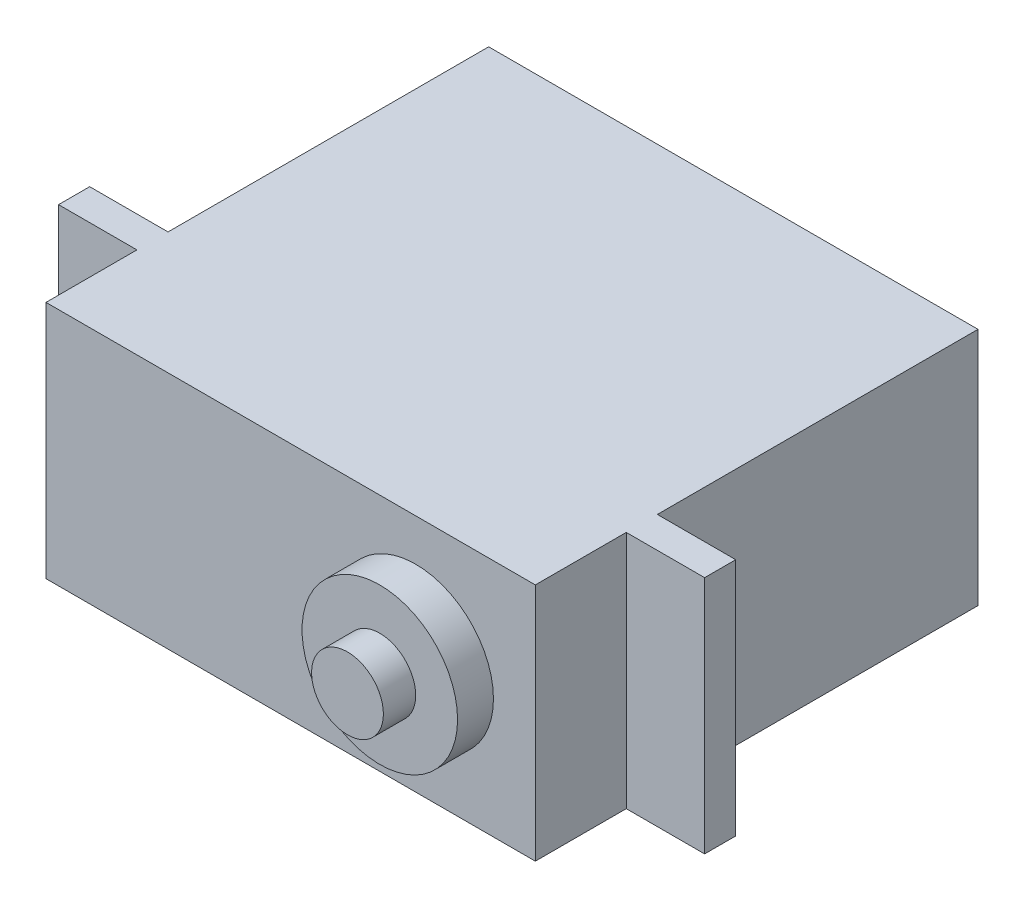
ISO-10303-21;
HEADER;
FILE_DESCRIPTION(('STEP AP214'),'2;1');
FILE_NAME('part.step','',(''),(''),'','','');
FILE_SCHEMA(('AUTOMOTIVE_DESIGN { 1 0 10303 214 1 1 1 1 }'));
ENDSEC;
DATA;
#1=APPLICATION_CONTEXT('core data for automotive mechanical design processes');
#2=APPLICATION_PROTOCOL_DEFINITION('international standard','automotive_design',2000,#1);
#3=PRODUCT_CONTEXT('',#1,'mechanical');
#4=PRODUCT('Part','Part','',(#3));
#5=PRODUCT_RELATED_PRODUCT_CATEGORY('part','',(#4));
#6=PRODUCT_DEFINITION_FORMATION('','',#4);
#7=PRODUCT_DEFINITION_CONTEXT('part definition',#1,'design');
#8=PRODUCT_DEFINITION('design','',#6,#7);
#9=PRODUCT_DEFINITION_SHAPE('','',#8);
#10=(LENGTH_UNIT() NAMED_UNIT(*) SI_UNIT(.MILLI.,.METRE.));
#11=(NAMED_UNIT(*) PLANE_ANGLE_UNIT() SI_UNIT($,.RADIAN.));
#12=(NAMED_UNIT(*) SI_UNIT($,.STERADIAN.) SOLID_ANGLE_UNIT());
#13=UNCERTAINTY_MEASURE_WITH_UNIT(LENGTH_MEASURE(1.E-05),#10,'distance_accuracy_value','');
#14=(GEOMETRIC_REPRESENTATION_CONTEXT(3) GLOBAL_UNCERTAINTY_ASSIGNED_CONTEXT((#13)) GLOBAL_UNIT_ASSIGNED_CONTEXT((#10,
#11,#12)) REPRESENTATION_CONTEXT('',''));
#15=CARTESIAN_POINT('',(0.,0.,0.));
#16=DIRECTION('',(0.,0.,1.));
#17=DIRECTION('',(1.,0.,0.));
#18=AXIS2_PLACEMENT_3D('',#15,#16,#17);
#19=CARTESIAN_POINT('',(-18.4,-10.,8.5));
#20=DIRECTION('',(1.,0.,0.));
#21=DIRECTION('',(0.,0.,-1.));
#22=AXIS2_PLACEMENT_3D('',#19,#20,#21);
#23=PLANE('',#22);
#24=DIRECTION('',(0.,1.,0.));
#25=VECTOR('',#24,1.);
#26=CARTESIAN_POINT('',(-18.4,-10.,0.9));
#27=LINE('',#26,#25);
#28=CARTESIAN_POINT('',(-18.4,-10.,0.9));
#29=VERTEX_POINT('',#28);
#30=CARTESIAN_POINT('',(-18.4,10.,0.9));
#31=VERTEX_POINT('',#30);
#32=EDGE_CURVE('E157',#29,#31,#27,.T.);
#33=ORIENTED_EDGE('',*,*,#32,.F.);
#34=DIRECTION('',(0.,0.,-1.));
#35=VECTOR('',#34,1.);
#36=CARTESIAN_POINT('',(-18.4,-10.,8.5));
#37=LINE('',#36,#35);
#38=CARTESIAN_POINT('',(-18.4,-10.,8.5));
#39=VERTEX_POINT('',#38);
#40=EDGE_CURVE('E139',#39,#29,#37,.T.);
#41=ORIENTED_EDGE('',*,*,#40,.F.);
#42=DIRECTION('',(0.,-1.,0.));
#43=VECTOR('',#42,1.);
#44=CARTESIAN_POINT('',(-18.4,-10.,8.5));
#45=LINE('',#44,#43);
#46=CARTESIAN_POINT('',(-18.4,10.,8.5));
#47=VERTEX_POINT('',#46);
#48=EDGE_CURVE('E169',#47,#39,#45,.T.);
#49=ORIENTED_EDGE('',*,*,#48,.F.);
#50=DIRECTION('',(0.,0.,-1.));
#51=VECTOR('',#50,1.);
#52=CARTESIAN_POINT('',(-18.4,10.,8.5));
#53=LINE('',#52,#51);
#54=EDGE_CURVE('E188',#47,#31,#53,.T.);
#55=ORIENTED_EDGE('',*,*,#54,.T.);
#56=EDGE_LOOP('',(#33,#41,#49,#55));
#57=FACE_BOUND('',#56,.T.);
#58=ADVANCED_FACE('F39',(#57),#23,.F.);
#59=CARTESIAN_POINT('',(22.5,-10.,8.5));
#60=DIRECTION('',(-1.,0.,0.));
#61=DIRECTION('',(0.,0.,1.));
#62=AXIS2_PLACEMENT_3D('',#59,#60,#61);
#63=PLANE('',#62);
#64=DIRECTION('',(0.,-1.,0.));
#65=VECTOR('',#64,1.);
#66=CARTESIAN_POINT('',(22.5,-10.,0.9));
#67=LINE('',#66,#65);
#68=CARTESIAN_POINT('',(22.5,10.,0.9));
#69=VERTEX_POINT('',#68);
#70=CARTESIAN_POINT('',(22.5,-10.,0.9));
#71=VERTEX_POINT('',#70);
#72=EDGE_CURVE('E48',#69,#71,#67,.T.);
#73=ORIENTED_EDGE('',*,*,#72,.F.);
#74=DIRECTION('',(0.,0.,-1.));
#75=VECTOR('',#74,1.);
#76=CARTESIAN_POINT('',(22.5,10.,8.5));
#77=LINE('',#76,#75);
#78=CARTESIAN_POINT('',(22.5,10.,8.5));
#79=VERTEX_POINT('',#78);
#80=EDGE_CURVE('E194',#79,#69,#77,.T.);
#81=ORIENTED_EDGE('',*,*,#80,.F.);
#82=DIRECTION('',(0.,1.,0.));
#83=VECTOR('',#82,1.);
#84=CARTESIAN_POINT('',(22.5,-10.,8.5));
#85=LINE('',#84,#83);
#86=CARTESIAN_POINT('',(22.5,-10.,8.5));
#87=VERTEX_POINT('',#86);
#88=EDGE_CURVE('E173',#87,#79,#85,.T.);
#89=ORIENTED_EDGE('',*,*,#88,.F.);
#90=DIRECTION('',(0.,0.,-1.));
#91=VECTOR('',#90,1.);
#92=CARTESIAN_POINT('',(22.5,-10.,8.5));
#93=LINE('',#92,#91);
#94=EDGE_CURVE('E197',#87,#71,#93,.T.);
#95=ORIENTED_EDGE('',*,*,#94,.T.);
#96=EDGE_LOOP('',(#73,#81,#89,#95));
#97=FACE_BOUND('',#96,.T.);
#98=ADVANCED_FACE('F214',(#97),#63,.F.);
#99=CARTESIAN_POINT('',(-18.4,-10.,-1.7));
#100=VERTEX_POINT('',#99);
#101=CARTESIAN_POINT('',(-18.4,-10.,-28.5));
#102=VERTEX_POINT('',#101);
#103=EDGE_CURVE('E199',#100,#102,#37,.T.);
#104=ORIENTED_EDGE('',*,*,#103,.F.);
#105=DIRECTION('',(0.,1.,0.));
#106=VECTOR('',#105,1.);
#107=CARTESIAN_POINT('',(-18.4,-10.,-1.7));
#108=LINE('',#107,#106);
#109=CARTESIAN_POINT('',(-18.4,10.,-1.7));
#110=VERTEX_POINT('',#109);
#111=EDGE_CURVE('E156',#100,#110,#108,.T.);
#112=ORIENTED_EDGE('',*,*,#111,.T.);
#113=CARTESIAN_POINT('',(-18.4,10.,-28.5));
#114=VERTEX_POINT('',#113);
#115=EDGE_CURVE('E179',#110,#114,#53,.T.);
#116=ORIENTED_EDGE('',*,*,#115,.T.);
#117=DIRECTION('',(0.,-1.,0.));
#118=VECTOR('',#117,1.);
#119=CARTESIAN_POINT('',(-18.4,-10.,-28.5));
#120=LINE('',#119,#118);
#121=EDGE_CURVE('E170',#114,#102,#120,.T.);
#122=ORIENTED_EDGE('',*,*,#121,.T.);
#123=EDGE_LOOP('',(#104,#112,#116,#122));
#124=FACE_BOUND('',#123,.T.);
#125=ADVANCED_FACE('F41',(#124),#23,.F.);
#126=CARTESIAN_POINT('',(-18.4,-10.,8.5));
#127=DIRECTION('',(0.,1.,0.));
#128=DIRECTION('',(0.,0.,1.));
#129=AXIS2_PLACEMENT_3D('',#126,#127,#128);
#130=PLANE('',#129);
#131=ORIENTED_EDGE('',*,*,#40,.T.);
#132=DIRECTION('',(1.,0.,0.));
#133=VECTOR('',#132,1.);
#134=CARTESIAN_POINT('',(-24.95,-10.,0.9));
#135=LINE('',#134,#133);
#136=CARTESIAN_POINT('',(-24.95,-10.,0.9));
#137=VERTEX_POINT('',#136);
#138=EDGE_CURVE('E128',#137,#29,#135,.T.);
#139=ORIENTED_EDGE('',*,*,#138,.F.);
#140=DIRECTION('',(0.,0.,-1.));
#141=VECTOR('',#140,1.);
#142=CARTESIAN_POINT('',(-24.95,-10.,0.9));
#143=LINE('',#142,#141);
#144=CARTESIAN_POINT('',(-24.95,-10.,-1.7));
#145=VERTEX_POINT('',#144);
#146=EDGE_CURVE('E132',#137,#145,#143,.T.);
#147=ORIENTED_EDGE('',*,*,#146,.T.);
#148=DIRECTION('',(1.,0.,0.));
#149=VECTOR('',#148,1.);
#150=CARTESIAN_POINT('',(-24.95,-10.,-1.7));
#151=LINE('',#150,#149);
#152=EDGE_CURVE('E227',#145,#100,#151,.T.);
#153=ORIENTED_EDGE('',*,*,#152,.T.);
#154=ORIENTED_EDGE('',*,*,#103,.T.);
#155=DIRECTION('',(1.,0.,0.));
#156=VECTOR('',#155,1.);
#157=CARTESIAN_POINT('',(-18.4,-10.,-28.5));
#158=LINE('',#157,#156);
#159=CARTESIAN_POINT('',(22.5,-10.,-28.5));
#160=VERTEX_POINT('',#159);
#161=EDGE_CURVE('E182',#102,#160,#158,.T.);
#162=ORIENTED_EDGE('',*,*,#161,.T.);
#163=CARTESIAN_POINT('',(22.5,-10.,-1.7));
#164=VERTEX_POINT('',#163);
#165=EDGE_CURVE('E198',#164,#160,#93,.T.);
#166=ORIENTED_EDGE('',*,*,#165,.F.);
#167=CARTESIAN_POINT('',(29.05,-10.,-1.7));
#168=VERTEX_POINT('',#167);
#169=EDGE_CURVE('E63',#164,#168,#151,.T.);
#170=ORIENTED_EDGE('',*,*,#169,.T.);
#171=DIRECTION('',(0.,0.,-1.));
#172=VECTOR('',#171,1.);
#173=CARTESIAN_POINT('',(29.05,-10.,0.9));
#174=LINE('',#173,#172);
#175=CARTESIAN_POINT('',(29.05,-10.,0.9));
#176=VERTEX_POINT('',#175);
#177=EDGE_CURVE('E160',#176,#168,#174,.T.);
#178=ORIENTED_EDGE('',*,*,#177,.F.);
#179=EDGE_CURVE('E142',#71,#176,#135,.T.);
#180=ORIENTED_EDGE('',*,*,#179,.F.);
#181=ORIENTED_EDGE('',*,*,#94,.F.);
#182=DIRECTION('',(1.,0.,0.));
#183=VECTOR('',#182,1.);
#184=CARTESIAN_POINT('',(-18.4,-10.,8.5));
#185=LINE('',#184,#183);
#186=EDGE_CURVE('E174',#39,#87,#185,.T.);
#187=ORIENTED_EDGE('',*,*,#186,.F.);
#188=EDGE_LOOP('',(#131,#139,#147,#153,#154,#162,#166,#170,#178,#180,#181,#187));
#189=FACE_BOUND('',#188,.T.);
#190=ADVANCED_FACE('F131',(#189),#130,.F.);
#191=CARTESIAN_POINT('',(22.5,10.,-1.7));
#192=VERTEX_POINT('',#191);
#193=CARTESIAN_POINT('',(22.5,10.,-28.5));
#194=VERTEX_POINT('',#193);
#195=EDGE_CURVE('E192',#192,#194,#77,.T.);
#196=ORIENTED_EDGE('',*,*,#195,.F.);
#197=DIRECTION('',(0.,-1.,0.));
#198=VECTOR('',#197,1.);
#199=CARTESIAN_POINT('',(22.5,-10.,-1.7));
#200=LINE('',#199,#198);
#201=EDGE_CURVE('E205',#192,#164,#200,.T.);
#202=ORIENTED_EDGE('',*,*,#201,.T.);
#203=ORIENTED_EDGE('',*,*,#165,.T.);
#204=DIRECTION('',(0.,1.,0.));
#205=VECTOR('',#204,1.);
#206=CARTESIAN_POINT('',(22.5,-10.,-28.5));
#207=LINE('',#206,#205);
#208=EDGE_CURVE('E184',#160,#194,#207,.T.);
#209=ORIENTED_EDGE('',*,*,#208,.T.);
#210=EDGE_LOOP('',(#196,#202,#203,#209));
#211=FACE_BOUND('',#210,.T.);
#212=ADVANCED_FACE('F243',(#211),#63,.F.);
#213=CARTESIAN_POINT('',(-18.4,10.,8.5));
#214=DIRECTION('',(0.,-1.,0.));
#215=DIRECTION('',(0.,0.,-1.));
#216=AXIS2_PLACEMENT_3D('',#213,#214,#215);
#217=PLANE('',#216);
#218=ORIENTED_EDGE('',*,*,#80,.T.);
#219=DIRECTION('',(-1.,0.,0.));
#220=VECTOR('',#219,1.);
#221=CARTESIAN_POINT('',(-24.95,10.,0.9));
#222=LINE('',#221,#220);
#223=CARTESIAN_POINT('',(29.05,10.,0.9));
#224=VERTEX_POINT('',#223);
#225=EDGE_CURVE('E207',#224,#69,#222,.T.);
#226=ORIENTED_EDGE('',*,*,#225,.F.);
#227=DIRECTION('',(0.,0.,-1.));
#228=VECTOR('',#227,1.);
#229=CARTESIAN_POINT('',(29.05,10.,0.9));
#230=LINE('',#229,#228);
#231=CARTESIAN_POINT('',(29.05,10.,-1.7));
#232=VERTEX_POINT('',#231);
#233=EDGE_CURVE('E165',#224,#232,#230,.T.);
#234=ORIENTED_EDGE('',*,*,#233,.T.);
#235=DIRECTION('',(-1.,0.,0.));
#236=VECTOR('',#235,1.);
#237=CARTESIAN_POINT('',(-24.95,10.,-1.7));
#238=LINE('',#237,#236);
#239=EDGE_CURVE('E155',#232,#192,#238,.T.);
#240=ORIENTED_EDGE('',*,*,#239,.T.);
#241=ORIENTED_EDGE('',*,*,#195,.T.);
#242=DIRECTION('',(-1.,0.,0.));
#243=VECTOR('',#242,1.);
#244=CARTESIAN_POINT('',(-18.4,10.,-28.5));
#245=LINE('',#244,#243);
#246=EDGE_CURVE('E171',#194,#114,#245,.T.);
#247=ORIENTED_EDGE('',*,*,#246,.T.);
#248=ORIENTED_EDGE('',*,*,#115,.F.);
#249=CARTESIAN_POINT('',(-24.95,10.,-1.7));
#250=VERTEX_POINT('',#249);
#251=EDGE_CURVE('E57',#110,#250,#238,.T.);
#252=ORIENTED_EDGE('',*,*,#251,.T.);
#253=DIRECTION('',(0.,0.,-1.));
#254=VECTOR('',#253,1.);
#255=CARTESIAN_POINT('',(-24.95,10.,0.9));
#256=LINE('',#255,#254);
#257=CARTESIAN_POINT('',(-24.95,10.,0.9));
#258=VERTEX_POINT('',#257);
#259=EDGE_CURVE('E221',#258,#250,#256,.T.);
#260=ORIENTED_EDGE('',*,*,#259,.F.);
#261=EDGE_CURVE('E146',#31,#258,#222,.T.);
#262=ORIENTED_EDGE('',*,*,#261,.F.);
#263=ORIENTED_EDGE('',*,*,#54,.F.);
#264=DIRECTION('',(-1.,0.,0.));
#265=VECTOR('',#264,1.);
#266=CARTESIAN_POINT('',(-18.4,10.,8.5));
#267=LINE('',#266,#265);
#268=EDGE_CURVE('E176',#79,#47,#267,.T.);
#269=ORIENTED_EDGE('',*,*,#268,.F.);
#270=EDGE_LOOP('',(#218,#226,#234,#240,#241,#247,#248,#252,#260,#262,#263,#269));
#271=FACE_BOUND('',#270,.T.);
#272=ADVANCED_FACE('F224',(#271),#217,.F.);
#273=CARTESIAN_POINT('',(0.,0.,8.5));
#274=DIRECTION('',(0.,0.,-1.));
#275=DIRECTION('',(-1.,0.,0.));
#276=AXIS2_PLACEMENT_3D('',#273,#274,#275);
#277=PLANE('',#276);
#278=CARTESIAN_POINT('',(12.5,0.,8.5));
#279=DIRECTION('',(0.,0.,1.));
#280=DIRECTION('',(1.,0.,0.));
#281=AXIS2_PLACEMENT_3D('',#278,#279,#280);
#282=CIRCLE('',#281,6.5);
#283=CARTESIAN_POINT('',(19.,0.,8.5));
#284=VERTEX_POINT('',#283);
#285=EDGE_CURVE('E11',#284,#284,#282,.T.);
#286=ORIENTED_EDGE('',*,*,#285,.F.);
#287=EDGE_LOOP('',(#286));
#288=FACE_BOUND('',#287,.T.);
#289=ORIENTED_EDGE('',*,*,#48,.T.);
#290=ORIENTED_EDGE('',*,*,#186,.T.);
#291=ORIENTED_EDGE('',*,*,#88,.T.);
#292=ORIENTED_EDGE('',*,*,#268,.T.);
#293=EDGE_LOOP('',(#289,#290,#291,#292));
#294=FACE_BOUND('',#293,.T.);
#295=ADVANCED_FACE('F217',(#288,#294),#277,.F.);
#296=CARTESIAN_POINT('',(0.,0.,-28.5));
#297=DIRECTION('',(0.,0.,-1.));
#298=DIRECTION('',(-1.,0.,0.));
#299=AXIS2_PLACEMENT_3D('',#296,#297,#298);
#300=PLANE('',#299);
#301=ORIENTED_EDGE('',*,*,#121,.F.);
#302=ORIENTED_EDGE('',*,*,#246,.F.);
#303=ORIENTED_EDGE('',*,*,#208,.F.);
#304=ORIENTED_EDGE('',*,*,#161,.F.);
#305=EDGE_LOOP('',(#301,#302,#303,#304));
#306=FACE_BOUND('',#305,.T.);
#307=ADVANCED_FACE('F253',(#306),#300,.T.);
#308=CARTESIAN_POINT('',(29.05,-10.,0.9));
#309=DIRECTION('',(-1.,0.,0.));
#310=DIRECTION('',(0.,0.,1.));
#311=AXIS2_PLACEMENT_3D('',#308,#309,#310);
#312=PLANE('',#311);
#313=DIRECTION('',(0.,1.,0.));
#314=VECTOR('',#313,1.);
#315=CARTESIAN_POINT('',(29.05,-10.,-1.7));
#316=LINE('',#315,#314);
#317=EDGE_CURVE('E232',#168,#232,#316,.T.);
#318=ORIENTED_EDGE('',*,*,#317,.T.);
#319=ORIENTED_EDGE('',*,*,#233,.F.);
#320=DIRECTION('',(0.,1.,0.));
#321=VECTOR('',#320,1.);
#322=CARTESIAN_POINT('',(29.05,-10.,0.9));
#323=LINE('',#322,#321);
#324=EDGE_CURVE('E143',#176,#224,#323,.T.);
#325=ORIENTED_EDGE('',*,*,#324,.F.);
#326=ORIENTED_EDGE('',*,*,#177,.T.);
#327=EDGE_LOOP('',(#318,#319,#325,#326));
#328=FACE_BOUND('',#327,.T.);
#329=ADVANCED_FACE('F266',(#328),#312,.F.);
#330=CARTESIAN_POINT('',(0.,0.,-1.7));
#331=DIRECTION('',(0.,0.,-1.));
#332=DIRECTION('',(-1.,0.,0.));
#333=AXIS2_PLACEMENT_3D('',#330,#331,#332);
#334=PLANE('',#333);
#335=ORIENTED_EDGE('',*,*,#201,.F.);
#336=ORIENTED_EDGE('',*,*,#239,.F.);
#337=ORIENTED_EDGE('',*,*,#317,.F.);
#338=ORIENTED_EDGE('',*,*,#169,.F.);
#339=EDGE_LOOP('',(#335,#336,#337,#338));
#340=FACE_BOUND('',#339,.T.);
#341=ADVANCED_FACE('F244',(#340),#334,.T.);
#342=CARTESIAN_POINT('',(0.,0.,0.9));
#343=DIRECTION('',(0.,0.,-1.));
#344=DIRECTION('',(-1.,0.,0.));
#345=AXIS2_PLACEMENT_3D('',#342,#343,#344);
#346=PLANE('',#345);
#347=ORIENTED_EDGE('',*,*,#225,.T.);
#348=ORIENTED_EDGE('',*,*,#72,.T.);
#349=ORIENTED_EDGE('',*,*,#179,.T.);
#350=ORIENTED_EDGE('',*,*,#324,.T.);
#351=EDGE_LOOP('',(#347,#348,#349,#350));
#352=FACE_BOUND('',#351,.T.);
#353=ADVANCED_FACE('F206',(#352),#346,.F.);
#354=ORIENTED_EDGE('',*,*,#138,.T.);
#355=ORIENTED_EDGE('',*,*,#32,.T.);
#356=ORIENTED_EDGE('',*,*,#261,.T.);
#357=DIRECTION('',(0.,-1.,0.));
#358=VECTOR('',#357,1.);
#359=CARTESIAN_POINT('',(-24.95,-10.,0.9));
#360=LINE('',#359,#358);
#361=EDGE_CURVE('E144',#258,#137,#360,.T.);
#362=ORIENTED_EDGE('',*,*,#361,.T.);
#363=EDGE_LOOP('',(#354,#355,#356,#362));
#364=FACE_BOUND('',#363,.T.);
#365=ADVANCED_FACE('F148',(#364),#346,.F.);
#366=ORIENTED_EDGE('',*,*,#111,.F.);
#367=ORIENTED_EDGE('',*,*,#152,.F.);
#368=DIRECTION('',(0.,-1.,0.));
#369=VECTOR('',#368,1.);
#370=CARTESIAN_POINT('',(-24.95,-10.,-1.7));
#371=LINE('',#370,#369);
#372=EDGE_CURVE('E154',#250,#145,#371,.T.);
#373=ORIENTED_EDGE('',*,*,#372,.F.);
#374=ORIENTED_EDGE('',*,*,#251,.F.);
#375=EDGE_LOOP('',(#366,#367,#373,#374));
#376=FACE_BOUND('',#375,.T.);
#377=ADVANCED_FACE('F255',(#376),#334,.T.);
#378=CARTESIAN_POINT('',(-24.95,-10.,0.9));
#379=DIRECTION('',(1.,0.,0.));
#380=DIRECTION('',(0.,0.,-1.));
#381=AXIS2_PLACEMENT_3D('',#378,#379,#380);
#382=PLANE('',#381);
#383=ORIENTED_EDGE('',*,*,#372,.T.);
#384=ORIENTED_EDGE('',*,*,#146,.F.);
#385=ORIENTED_EDGE('',*,*,#361,.F.);
#386=ORIENTED_EDGE('',*,*,#259,.T.);
#387=EDGE_LOOP('',(#383,#384,#385,#386));
#388=FACE_BOUND('',#387,.T.);
#389=ADVANCED_FACE('F152',(#388),#382,.F.);
#390=CARTESIAN_POINT('',(12.5,0.,11.5));
#391=DIRECTION('',(0.,0.,-1.));
#392=DIRECTION('',(-1.,0.,0.));
#393=AXIS2_PLACEMENT_3D('',#390,#391,#392);
#394=CYLINDRICAL_SURFACE('',#393,6.5);
#395=CARTESIAN_POINT('',(12.5,0.,11.5));
#396=DIRECTION('',(0.,0.,1.));
#397=DIRECTION('',(1.,0.,0.));
#398=AXIS2_PLACEMENT_3D('',#395,#396,#397);
#399=CIRCLE('',#398,6.5);
#400=CARTESIAN_POINT('',(19.,0.,11.5));
#401=VERTEX_POINT('',#400);
#402=EDGE_CURVE('E228',#401,#401,#399,.T.);
#403=ORIENTED_EDGE('',*,*,#402,.F.);
#404=EDGE_LOOP('',(#403));
#405=FACE_BOUND('',#404,.T.);
#406=ORIENTED_EDGE('',*,*,#285,.T.);
#407=EDGE_LOOP('',(#406));
#408=FACE_BOUND('',#407,.T.);
#409=ADVANCED_FACE('F261',(#405,#408),#394,.T.);
#410=CARTESIAN_POINT('',(12.5,0.,11.5));
#411=DIRECTION('',(0.,0.,1.));
#412=DIRECTION('',(1.,0.,0.));
#413=AXIS2_PLACEMENT_3D('',#410,#411,#412);
#414=PLANE('',#413);
#415=CARTESIAN_POINT('',(12.5,0.,11.5));
#416=DIRECTION('',(0.,0.,1.));
#417=DIRECTION('',(1.,0.,0.));
#418=AXIS2_PLACEMENT_3D('',#415,#416,#417);
#419=CIRCLE('',#418,3.);
#420=CARTESIAN_POINT('',(15.5,0.,11.5));
#421=VERTEX_POINT('',#420);
#422=EDGE_CURVE('E43',#421,#421,#419,.F.);
#423=ORIENTED_EDGE('',*,*,#422,.T.);
#424=EDGE_LOOP('',(#423));
#425=FACE_BOUND('',#424,.T.);
#426=ORIENTED_EDGE('',*,*,#402,.T.);
#427=EDGE_LOOP('',(#426));
#428=FACE_BOUND('',#427,.T.);
#429=ADVANCED_FACE('F330',(#425,#428),#414,.T.);
#430=CARTESIAN_POINT('',(12.5,0.,14.2));
#431=DIRECTION('',(0.,0.,-1.));
#432=DIRECTION('',(-1.,0.,0.));
#433=AXIS2_PLACEMENT_3D('',#430,#431,#432);
#434=CYLINDRICAL_SURFACE('',#433,3.);
#435=ORIENTED_EDGE('',*,*,#422,.F.);
#436=EDGE_LOOP('',(#435));
#437=FACE_BOUND('',#436,.T.);
#438=CARTESIAN_POINT('',(12.5,0.,14.2));
#439=DIRECTION('',(0.,0.,1.));
#440=DIRECTION('',(1.,0.,0.));
#441=AXIS2_PLACEMENT_3D('',#438,#439,#440);
#442=CIRCLE('',#441,3.);
#443=CARTESIAN_POINT('',(15.5,0.,14.2));
#444=VERTEX_POINT('',#443);
#445=EDGE_CURVE('E362',#444,#444,#442,.T.);
#446=ORIENTED_EDGE('',*,*,#445,.F.);
#447=EDGE_LOOP('',(#446));
#448=FACE_BOUND('',#447,.T.);
#449=ADVANCED_FACE('F336',(#437,#448),#434,.T.);
#450=CARTESIAN_POINT('',(12.5,0.,14.2));
#451=DIRECTION('',(0.,0.,1.));
#452=DIRECTION('',(1.,0.,0.));
#453=AXIS2_PLACEMENT_3D('',#450,#451,#452);
#454=PLANE('',#453);
#455=ORIENTED_EDGE('',*,*,#445,.T.);
#456=EDGE_LOOP('',(#455));
#457=FACE_BOUND('',#456,.T.);
#458=ADVANCED_FACE('F350',(#457),#454,.T.);
#459=CLOSED_SHELL('',(#58,#98,#125,#190,#212,#272,#295,#307,#329,#341,#353,#365,#377,#389,#409,
#429,#449,#458));
#460=MANIFOLD_SOLID_BREP('B2',#459);
#461=ADVANCED_BREP_SHAPE_REPRESENTATION('',(#18,#460),#14);
#462=SHAPE_DEFINITION_REPRESENTATION(#9,#461);
ENDSEC;
END-ISO-10303-21;
